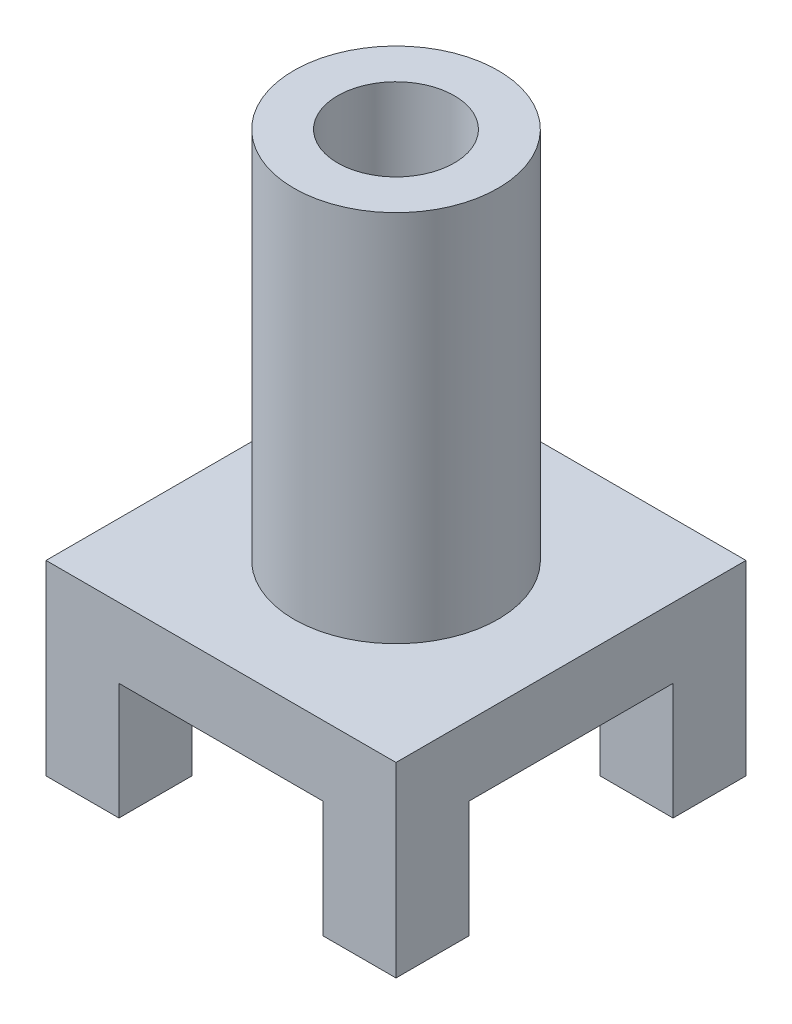
ISO-10303-21;
HEADER;
FILE_DESCRIPTION(('STEP AP214'),'2;1');
FILE_NAME('part.step','',(''),(''),'','','');
FILE_SCHEMA(('AUTOMOTIVE_DESIGN { 1 0 10303 214 1 1 1 1 }'));
ENDSEC;
DATA;
#1=APPLICATION_CONTEXT('core data for automotive mechanical design processes');
#2=APPLICATION_PROTOCOL_DEFINITION('international standard','automotive_design',2000,#1);
#3=PRODUCT_CONTEXT('',#1,'mechanical');
#4=PRODUCT('Part','Part','',(#3));
#5=PRODUCT_RELATED_PRODUCT_CATEGORY('part','',(#4));
#6=PRODUCT_DEFINITION_FORMATION('','',#4);
#7=PRODUCT_DEFINITION_CONTEXT('part definition',#1,'design');
#8=PRODUCT_DEFINITION('design','',#6,#7);
#9=PRODUCT_DEFINITION_SHAPE('','',#8);
#10=(LENGTH_UNIT() NAMED_UNIT(*) SI_UNIT(.MILLI.,.METRE.));
#11=(NAMED_UNIT(*) PLANE_ANGLE_UNIT() SI_UNIT($,.RADIAN.));
#12=(NAMED_UNIT(*) SI_UNIT($,.STERADIAN.) SOLID_ANGLE_UNIT());
#13=UNCERTAINTY_MEASURE_WITH_UNIT(LENGTH_MEASURE(1.E-05),#10,'distance_accuracy_value','');
#14=(GEOMETRIC_REPRESENTATION_CONTEXT(3) GLOBAL_UNCERTAINTY_ASSIGNED_CONTEXT((#13)) GLOBAL_UNIT_ASSIGNED_CONTEXT((#10,
#11,#12)) REPRESENTATION_CONTEXT('',''));
#15=CARTESIAN_POINT('',(0.,0.,0.));
#16=DIRECTION('',(0.,0.,1.));
#17=DIRECTION('',(1.,0.,0.));
#18=AXIS2_PLACEMENT_3D('',#15,#16,#17);
#19=CARTESIAN_POINT('',(0.,0.,0.));
#20=DIRECTION('',(0.,1.,0.));
#21=DIRECTION('',(0.,0.,1.));
#22=AXIS2_PLACEMENT_3D('',#19,#20,#21);
#23=PLANE('',#22);
#24=DIRECTION('',(0.,0.,1.));
#25=VECTOR('',#24,1.);
#26=CARTESIAN_POINT('',(-17.5,0.,-30.));
#27=LINE('',#26,#25);
#28=CARTESIAN_POINT('',(-17.5,0.,17.5));
#29=VERTEX_POINT('',#28);
#30=CARTESIAN_POINT('',(-17.5,0.,30.));
#31=VERTEX_POINT('',#30);
#32=EDGE_CURVE('E64',#29,#31,#27,.T.);
#33=ORIENTED_EDGE('',*,*,#32,.T.);
#34=DIRECTION('',(1.,0.,0.));
#35=VECTOR('',#34,1.);
#36=CARTESIAN_POINT('',(-30.,0.,30.));
#37=LINE('',#36,#35);
#38=CARTESIAN_POINT('',(-30.,0.,30.));
#39=VERTEX_POINT('',#38);
#40=EDGE_CURVE('E280',#39,#31,#37,.T.);
#41=ORIENTED_EDGE('',*,*,#40,.F.);
#42=DIRECTION('',(0.,0.,-1.));
#43=VECTOR('',#42,1.);
#44=CARTESIAN_POINT('',(-30.,0.,30.));
#45=LINE('',#44,#43);
#46=CARTESIAN_POINT('',(-30.,0.,17.5));
#47=VERTEX_POINT('',#46);
#48=EDGE_CURVE('E259',#39,#47,#45,.T.);
#49=ORIENTED_EDGE('',*,*,#48,.T.);
#50=DIRECTION('',(1.,0.,0.));
#51=VECTOR('',#50,1.);
#52=CARTESIAN_POINT('',(-30.,0.,17.5));
#53=LINE('',#52,#51);
#54=EDGE_CURVE('E241',#47,#29,#53,.T.);
#55=ORIENTED_EDGE('',*,*,#54,.T.);
#56=EDGE_LOOP('',(#33,#41,#49,#55));
#57=FACE_BOUND('',#56,.T.);
#58=ADVANCED_FACE('F39',(#57),#23,.F.);
#59=CARTESIAN_POINT('',(-17.5,0.,-30.));
#60=VERTEX_POINT('',#59);
#61=CARTESIAN_POINT('',(-17.5,0.,-17.5));
#62=VERTEX_POINT('',#61);
#63=EDGE_CURVE('E201',#60,#62,#27,.T.);
#64=ORIENTED_EDGE('',*,*,#63,.T.);
#65=DIRECTION('',(1.,0.,0.));
#66=VECTOR('',#65,1.);
#67=CARTESIAN_POINT('',(-30.,0.,-17.5));
#68=LINE('',#67,#66);
#69=CARTESIAN_POINT('',(-30.,0.,-17.5));
#70=VERTEX_POINT('',#69);
#71=EDGE_CURVE('E246',#70,#62,#68,.T.);
#72=ORIENTED_EDGE('',*,*,#71,.F.);
#73=CARTESIAN_POINT('',(-30.,0.,-30.));
#74=VERTEX_POINT('',#73);
#75=EDGE_CURVE('E284',#70,#74,#45,.T.);
#76=ORIENTED_EDGE('',*,*,#75,.T.);
#77=DIRECTION('',(1.,0.,0.));
#78=VECTOR('',#77,1.);
#79=CARTESIAN_POINT('',(-30.,0.,-30.));
#80=LINE('',#79,#78);
#81=EDGE_CURVE('E270',#74,#60,#80,.T.);
#82=ORIENTED_EDGE('',*,*,#81,.T.);
#83=EDGE_LOOP('',(#64,#72,#76,#82));
#84=FACE_BOUND('',#83,.T.);
#85=ADVANCED_FACE('F376',(#84),#23,.F.);
#86=CARTESIAN_POINT('',(-30.,0.,-17.5));
#87=DIRECTION('',(0.,0.,-1.));
#88=DIRECTION('',(-1.,0.,0.));
#89=AXIS2_PLACEMENT_3D('',#86,#87,#88);
#90=PLANE('',#89);
#91=DIRECTION('',(0.,-1.,0.));
#92=VECTOR('',#91,1.);
#93=CARTESIAN_POINT('',(-17.5,0.,-17.5));
#94=LINE('',#93,#92);
#95=CARTESIAN_POINT('',(-17.5,20.,-17.5));
#96=VERTEX_POINT('',#95);
#97=EDGE_CURVE('E174',#96,#62,#94,.T.);
#98=ORIENTED_EDGE('',*,*,#97,.F.);
#99=DIRECTION('',(1.,0.,0.));
#100=VECTOR('',#99,1.);
#101=CARTESIAN_POINT('',(-30.,20.,-17.5));
#102=LINE('',#101,#100);
#103=CARTESIAN_POINT('',(-30.,20.,-17.5));
#104=VERTEX_POINT('',#103);
#105=EDGE_CURVE('E251',#104,#96,#102,.T.);
#106=ORIENTED_EDGE('',*,*,#105,.F.);
#107=DIRECTION('',(0.,1.,0.));
#108=VECTOR('',#107,1.);
#109=CARTESIAN_POINT('',(-30.,0.,-17.5));
#110=LINE('',#109,#108);
#111=EDGE_CURVE('E217',#70,#104,#110,.T.);
#112=ORIENTED_EDGE('',*,*,#111,.F.);
#113=ORIENTED_EDGE('',*,*,#71,.T.);
#114=EDGE_LOOP('',(#98,#106,#112,#113));
#115=FACE_BOUND('',#114,.T.);
#116=ADVANCED_FACE('F341',(#115),#90,.F.);
#117=CARTESIAN_POINT('',(-30.,0.,17.5));
#118=DIRECTION('',(0.,0.,-1.));
#119=DIRECTION('',(-1.,0.,0.));
#120=AXIS2_PLACEMENT_3D('',#117,#118,#119);
#121=PLANE('',#120);
#122=DIRECTION('',(1.,0.,0.));
#123=VECTOR('',#122,1.);
#124=CARTESIAN_POINT('',(-30.,20.,17.5));
#125=LINE('',#124,#123);
#126=CARTESIAN_POINT('',(-30.,20.,17.5));
#127=VERTEX_POINT('',#126);
#128=CARTESIAN_POINT('',(-17.5,20.,17.5));
#129=VERTEX_POINT('',#128);
#130=EDGE_CURVE('E236',#127,#129,#125,.T.);
#131=ORIENTED_EDGE('',*,*,#130,.T.);
#132=DIRECTION('',(0.,-1.,0.));
#133=VECTOR('',#132,1.);
#134=CARTESIAN_POINT('',(-17.5,0.,17.5));
#135=LINE('',#134,#133);
#136=EDGE_CURVE('E292',#129,#29,#135,.T.);
#137=ORIENTED_EDGE('',*,*,#136,.T.);
#138=ORIENTED_EDGE('',*,*,#54,.F.);
#139=DIRECTION('',(0.,1.,0.));
#140=VECTOR('',#139,1.);
#141=CARTESIAN_POINT('',(-30.,0.,17.5));
#142=LINE('',#141,#140);
#143=EDGE_CURVE('E222',#47,#127,#142,.T.);
#144=ORIENTED_EDGE('',*,*,#143,.T.);
#145=EDGE_LOOP('',(#131,#137,#138,#144));
#146=FACE_BOUND('',#145,.T.);
#147=ADVANCED_FACE('F338',(#146),#121,.T.);
#148=CARTESIAN_POINT('',(17.5,0.,30.));
#149=VERTEX_POINT('',#148);
#150=CARTESIAN_POINT('',(30.,0.,30.));
#151=VERTEX_POINT('',#150);
#152=EDGE_CURVE('E279',#149,#151,#37,.T.);
#153=ORIENTED_EDGE('',*,*,#152,.F.);
#154=DIRECTION('',(0.,0.,1.));
#155=VECTOR('',#154,1.);
#156=CARTESIAN_POINT('',(17.5,0.,-30.));
#157=LINE('',#156,#155);
#158=CARTESIAN_POINT('',(17.5,0.,17.5));
#159=VERTEX_POINT('',#158);
#160=EDGE_CURVE('E205',#159,#149,#157,.T.);
#161=ORIENTED_EDGE('',*,*,#160,.F.);
#162=CARTESIAN_POINT('',(30.,0.,17.5));
#163=VERTEX_POINT('',#162);
#164=EDGE_CURVE('E240',#159,#163,#53,.T.);
#165=ORIENTED_EDGE('',*,*,#164,.T.);
#166=DIRECTION('',(0.,0.,-1.));
#167=VECTOR('',#166,1.);
#168=CARTESIAN_POINT('',(30.,0.,30.));
#169=LINE('',#168,#167);
#170=EDGE_CURVE('E275',#151,#163,#169,.T.);
#171=ORIENTED_EDGE('',*,*,#170,.F.);
#172=EDGE_LOOP('',(#153,#161,#165,#171));
#173=FACE_BOUND('',#172,.T.);
#174=ADVANCED_FACE('F313',(#173),#23,.F.);
#175=CARTESIAN_POINT('',(-30.,32.,-30.));
#176=DIRECTION('',(0.,0.,-1.));
#177=DIRECTION('',(-1.,0.,0.));
#178=AXIS2_PLACEMENT_3D('',#175,#176,#177);
#179=PLANE('',#178);
#180=DIRECTION('',(0.,1.,0.));
#181=VECTOR('',#180,1.);
#182=CARTESIAN_POINT('',(17.5,0.,-30.));
#183=LINE('',#182,#181);
#184=CARTESIAN_POINT('',(17.5,0.,-30.));
#185=VERTEX_POINT('',#184);
#186=CARTESIAN_POINT('',(17.5,20.,-30.));
#187=VERTEX_POINT('',#186);
#188=EDGE_CURVE('E165',#185,#187,#183,.T.);
#189=ORIENTED_EDGE('',*,*,#188,.T.);
#190=DIRECTION('',(1.,0.,0.));
#191=VECTOR('',#190,1.);
#192=CARTESIAN_POINT('',(-17.5,20.,-30.));
#193=LINE('',#192,#191);
#194=CARTESIAN_POINT('',(-17.5,20.,-30.));
#195=VERTEX_POINT('',#194);
#196=EDGE_CURVE('E154',#195,#187,#193,.T.);
#197=ORIENTED_EDGE('',*,*,#196,.F.);
#198=DIRECTION('',(0.,1.,0.));
#199=VECTOR('',#198,1.);
#200=CARTESIAN_POINT('',(-17.5,0.,-30.));
#201=LINE('',#200,#199);
#202=EDGE_CURVE('E181',#60,#195,#201,.T.);
#203=ORIENTED_EDGE('',*,*,#202,.F.);
#204=ORIENTED_EDGE('',*,*,#81,.F.);
#205=DIRECTION('',(0.,-1.,0.));
#206=VECTOR('',#205,1.);
#207=CARTESIAN_POINT('',(-30.,32.,-30.));
#208=LINE('',#207,#206);
#209=CARTESIAN_POINT('',(-30.,32.,-30.));
#210=VERTEX_POINT('',#209);
#211=EDGE_CURVE('E288',#210,#74,#208,.T.);
#212=ORIENTED_EDGE('',*,*,#211,.F.);
#213=DIRECTION('',(1.,0.,0.));
#214=VECTOR('',#213,1.);
#215=CARTESIAN_POINT('',(-30.,32.,-30.));
#216=LINE('',#215,#214);
#217=CARTESIAN_POINT('',(30.,32.,-30.));
#218=VERTEX_POINT('',#217);
#219=EDGE_CURVE('E254',#210,#218,#216,.T.);
#220=ORIENTED_EDGE('',*,*,#219,.T.);
#221=DIRECTION('',(0.,-1.,0.));
#222=VECTOR('',#221,1.);
#223=CARTESIAN_POINT('',(30.,32.,-30.));
#224=LINE('',#223,#222);
#225=CARTESIAN_POINT('',(30.,0.,-30.));
#226=VERTEX_POINT('',#225);
#227=EDGE_CURVE('E269',#218,#226,#224,.T.);
#228=ORIENTED_EDGE('',*,*,#227,.T.);
#229=EDGE_CURVE('E179',#185,#226,#80,.T.);
#230=ORIENTED_EDGE('',*,*,#229,.F.);
#231=EDGE_LOOP('',(#189,#197,#203,#204,#212,#220,#228,#230));
#232=FACE_BOUND('',#231,.T.);
#233=ADVANCED_FACE('F41',(#232),#179,.T.);
#234=CARTESIAN_POINT('',(-30.,32.,30.));
#235=DIRECTION('',(-1.,0.,0.));
#236=DIRECTION('',(0.,0.,1.));
#237=AXIS2_PLACEMENT_3D('',#234,#235,#236);
#238=PLANE('',#237);
#239=ORIENTED_EDGE('',*,*,#111,.T.);
#240=DIRECTION('',(0.,0.,-1.));
#241=VECTOR('',#240,1.);
#242=CARTESIAN_POINT('',(-30.,20.,17.5));
#243=LINE('',#242,#241);
#244=EDGE_CURVE('E214',#127,#104,#243,.T.);
#245=ORIENTED_EDGE('',*,*,#244,.F.);
#246=ORIENTED_EDGE('',*,*,#143,.F.);
#247=ORIENTED_EDGE('',*,*,#48,.F.);
#248=DIRECTION('',(0.,-1.,0.));
#249=VECTOR('',#248,1.);
#250=CARTESIAN_POINT('',(-30.,32.,30.));
#251=LINE('',#250,#249);
#252=CARTESIAN_POINT('',(-30.,32.,30.));
#253=VERTEX_POINT('',#252);
#254=EDGE_CURVE('E293',#253,#39,#251,.T.);
#255=ORIENTED_EDGE('',*,*,#254,.F.);
#256=DIRECTION('',(0.,0.,-1.));
#257=VECTOR('',#256,1.);
#258=CARTESIAN_POINT('',(-30.,32.,30.));
#259=LINE('',#258,#257);
#260=EDGE_CURVE('E265',#253,#210,#259,.T.);
#261=ORIENTED_EDGE('',*,*,#260,.T.);
#262=ORIENTED_EDGE('',*,*,#211,.T.);
#263=ORIENTED_EDGE('',*,*,#75,.F.);
#264=EDGE_LOOP('',(#239,#245,#246,#247,#255,#261,#262,#263));
#265=FACE_BOUND('',#264,.T.);
#266=ADVANCED_FACE('F336',(#265),#238,.T.);
#267=CARTESIAN_POINT('',(-30.,32.,30.));
#268=DIRECTION('',(0.,0.,-1.));
#269=DIRECTION('',(-1.,0.,0.));
#270=AXIS2_PLACEMENT_3D('',#267,#268,#269);
#271=PLANE('',#270);
#272=DIRECTION('',(1.,0.,0.));
#273=VECTOR('',#272,1.);
#274=CARTESIAN_POINT('',(-17.5,20.,30.));
#275=LINE('',#274,#273);
#276=CARTESIAN_POINT('',(-17.5,20.,30.));
#277=VERTEX_POINT('',#276);
#278=CARTESIAN_POINT('',(17.5,20.,30.));
#279=VERTEX_POINT('',#278);
#280=EDGE_CURVE('E187',#277,#279,#275,.T.);
#281=ORIENTED_EDGE('',*,*,#280,.T.);
#282=DIRECTION('',(0.,1.,0.));
#283=VECTOR('',#282,1.);
#284=CARTESIAN_POINT('',(17.5,0.,30.));
#285=LINE('',#284,#283);
#286=EDGE_CURVE('E191',#149,#279,#285,.T.);
#287=ORIENTED_EDGE('',*,*,#286,.F.);
#288=ORIENTED_EDGE('',*,*,#152,.T.);
#289=DIRECTION('',(0.,-1.,0.));
#290=VECTOR('',#289,1.);
#291=CARTESIAN_POINT('',(30.,32.,30.));
#292=LINE('',#291,#290);
#293=CARTESIAN_POINT('',(30.,32.,30.));
#294=VERTEX_POINT('',#293);
#295=EDGE_CURVE('E296',#294,#151,#292,.T.);
#296=ORIENTED_EDGE('',*,*,#295,.F.);
#297=DIRECTION('',(1.,0.,0.));
#298=VECTOR('',#297,1.);
#299=CARTESIAN_POINT('',(-30.,32.,30.));
#300=LINE('',#299,#298);
#301=EDGE_CURVE('E262',#253,#294,#300,.T.);
#302=ORIENTED_EDGE('',*,*,#301,.F.);
#303=ORIENTED_EDGE('',*,*,#254,.T.);
#304=ORIENTED_EDGE('',*,*,#40,.T.);
#305=DIRECTION('',(0.,1.,0.));
#306=VECTOR('',#305,1.);
#307=CARTESIAN_POINT('',(-17.5,0.,30.));
#308=LINE('',#307,#306);
#309=EDGE_CURVE('E166',#31,#277,#308,.T.);
#310=ORIENTED_EDGE('',*,*,#309,.T.);
#311=EDGE_LOOP('',(#281,#287,#288,#296,#302,#303,#304,#310));
#312=FACE_BOUND('',#311,.T.);
#313=ADVANCED_FACE('F329',(#312),#271,.F.);
#314=CARTESIAN_POINT('',(30.,32.,30.));
#315=DIRECTION('',(-1.,0.,0.));
#316=DIRECTION('',(0.,0.,1.));
#317=AXIS2_PLACEMENT_3D('',#314,#315,#316);
#318=PLANE('',#317);
#319=DIRECTION('',(0.,0.,-1.));
#320=VECTOR('',#319,1.);
#321=CARTESIAN_POINT('',(30.,20.,17.5));
#322=LINE('',#321,#320);
#323=CARTESIAN_POINT('',(30.,20.,17.5));
#324=VERTEX_POINT('',#323);
#325=CARTESIAN_POINT('',(30.,20.,-17.5));
#326=VERTEX_POINT('',#325);
#327=EDGE_CURVE('E213',#324,#326,#322,.T.);
#328=ORIENTED_EDGE('',*,*,#327,.T.);
#329=DIRECTION('',(0.,1.,0.));
#330=VECTOR('',#329,1.);
#331=CARTESIAN_POINT('',(30.,0.,-17.5));
#332=LINE('',#331,#330);
#333=CARTESIAN_POINT('',(30.,0.,-17.5));
#334=VERTEX_POINT('',#333);
#335=EDGE_CURVE('E229',#334,#326,#332,.T.);
#336=ORIENTED_EDGE('',*,*,#335,.F.);
#337=EDGE_CURVE('E274',#334,#226,#169,.T.);
#338=ORIENTED_EDGE('',*,*,#337,.T.);
#339=ORIENTED_EDGE('',*,*,#227,.F.);
#340=DIRECTION('',(0.,0.,-1.));
#341=VECTOR('',#340,1.);
#342=CARTESIAN_POINT('',(30.,32.,30.));
#343=LINE('',#342,#341);
#344=EDGE_CURVE('E258',#294,#218,#343,.T.);
#345=ORIENTED_EDGE('',*,*,#344,.F.);
#346=ORIENTED_EDGE('',*,*,#295,.T.);
#347=ORIENTED_EDGE('',*,*,#170,.T.);
#348=DIRECTION('',(0.,1.,0.));
#349=VECTOR('',#348,1.);
#350=CARTESIAN_POINT('',(30.,0.,17.5));
#351=LINE('',#350,#349);
#352=EDGE_CURVE('E218',#163,#324,#351,.T.);
#353=ORIENTED_EDGE('',*,*,#352,.T.);
#354=EDGE_LOOP('',(#328,#336,#338,#339,#345,#346,#347,#353));
#355=FACE_BOUND('',#354,.T.);
#356=ADVANCED_FACE('F359',(#355),#318,.F.);
#357=CARTESIAN_POINT('',(0.,32.,0.));
#358=DIRECTION('',(0.,1.,0.));
#359=DIRECTION('',(0.,0.,1.));
#360=AXIS2_PLACEMENT_3D('',#357,#358,#359);
#361=PLANE('',#360);
#362=CARTESIAN_POINT('',(0.,32.,0.));
#363=DIRECTION('',(0.,1.,0.));
#364=DIRECTION('',(0.,0.,1.));
#365=AXIS2_PLACEMENT_3D('',#362,#363,#364);
#366=CIRCLE('',#365,17.5);
#367=CARTESIAN_POINT('',(0.,32.,17.5));
#368=VERTEX_POINT('',#367);
#369=EDGE_CURVE('E11',#368,#368,#366,.T.);
#370=ORIENTED_EDGE('',*,*,#369,.F.);
#371=EDGE_LOOP('',(#370));
#372=FACE_BOUND('',#371,.T.);
#373=ORIENTED_EDGE('',*,*,#219,.F.);
#374=ORIENTED_EDGE('',*,*,#260,.F.);
#375=ORIENTED_EDGE('',*,*,#301,.T.);
#376=ORIENTED_EDGE('',*,*,#344,.T.);
#377=EDGE_LOOP('',(#373,#374,#375,#376));
#378=FACE_BOUND('',#377,.T.);
#379=ADVANCED_FACE('F364',(#372,#378),#361,.T.);
#380=CARTESIAN_POINT('',(17.5,0.,-17.5));
#381=VERTEX_POINT('',#380);
#382=EDGE_CURVE('E245',#381,#334,#68,.T.);
#383=ORIENTED_EDGE('',*,*,#382,.F.);
#384=EDGE_CURVE('E206',#185,#381,#157,.T.);
#385=ORIENTED_EDGE('',*,*,#384,.F.);
#386=ORIENTED_EDGE('',*,*,#229,.T.);
#387=ORIENTED_EDGE('',*,*,#337,.F.);
#388=EDGE_LOOP('',(#383,#385,#386,#387));
#389=FACE_BOUND('',#388,.T.);
#390=ADVANCED_FACE('F362',(#389),#23,.F.);
#391=CARTESIAN_POINT('',(-30.,20.,17.5));
#392=DIRECTION('',(0.,-1.,0.));
#393=DIRECTION('',(0.,0.,-1.));
#394=AXIS2_PLACEMENT_3D('',#391,#392,#393);
#395=PLANE('',#394);
#396=CARTESIAN_POINT('',(0.,20.,0.));
#397=DIRECTION('',(0.,-1.,0.));
#398=DIRECTION('',(0.,0.,-1.));
#399=AXIS2_PLACEMENT_3D('',#396,#397,#398);
#400=CIRCLE('',#399,10.);
#401=CARTESIAN_POINT('',(0.,20.,-10.));
#402=VERTEX_POINT('',#401);
#403=EDGE_CURVE('E452',#402,#402,#400,.T.);
#404=ORIENTED_EDGE('',*,*,#403,.F.);
#405=EDGE_LOOP('',(#404));
#406=FACE_BOUND('',#405,.T.);
#407=CARTESIAN_POINT('',(17.5,20.,17.5));
#408=VERTEX_POINT('',#407);
#409=EDGE_CURVE('E225',#408,#324,#125,.T.);
#410=ORIENTED_EDGE('',*,*,#409,.F.);
#411=DIRECTION('',(0.,0.,1.));
#412=VECTOR('',#411,1.);
#413=CARTESIAN_POINT('',(17.5,20.,-30.));
#414=LINE('',#413,#412);
#415=EDGE_CURVE('E175',#408,#279,#414,.T.);
#416=ORIENTED_EDGE('',*,*,#415,.T.);
#417=ORIENTED_EDGE('',*,*,#280,.F.);
#418=DIRECTION('',(0.,0.,1.));
#419=VECTOR('',#418,1.);
#420=CARTESIAN_POINT('',(-17.5,20.,-30.));
#421=LINE('',#420,#419);
#422=EDGE_CURVE('E184',#129,#277,#421,.T.);
#423=ORIENTED_EDGE('',*,*,#422,.F.);
#424=ORIENTED_EDGE('',*,*,#130,.F.);
#425=ORIENTED_EDGE('',*,*,#244,.T.);
#426=ORIENTED_EDGE('',*,*,#105,.T.);
#427=EDGE_CURVE('E56',#195,#96,#421,.T.);
#428=ORIENTED_EDGE('',*,*,#427,.F.);
#429=ORIENTED_EDGE('',*,*,#196,.T.);
#430=CARTESIAN_POINT('',(17.5,20.,-17.5));
#431=VERTEX_POINT('',#430);
#432=EDGE_CURVE('E158',#187,#431,#414,.T.);
#433=ORIENTED_EDGE('',*,*,#432,.T.);
#434=EDGE_CURVE('E250',#431,#326,#102,.T.);
#435=ORIENTED_EDGE('',*,*,#434,.T.);
#436=ORIENTED_EDGE('',*,*,#327,.F.);
#437=EDGE_LOOP('',(#410,#416,#417,#423,#424,#425,#426,#428,#429,#433,#435,#436));
#438=FACE_BOUND('',#437,.T.);
#439=ADVANCED_FACE('F157',(#406,#438),#395,.T.);
#440=ORIENTED_EDGE('',*,*,#434,.F.);
#441=DIRECTION('',(0.,-1.,0.));
#442=VECTOR('',#441,1.);
#443=CARTESIAN_POINT('',(17.5,0.,-17.5));
#444=LINE('',#443,#442);
#445=EDGE_CURVE('E172',#431,#381,#444,.T.);
#446=ORIENTED_EDGE('',*,*,#445,.T.);
#447=ORIENTED_EDGE('',*,*,#382,.T.);
#448=ORIENTED_EDGE('',*,*,#335,.T.);
#449=EDGE_LOOP('',(#440,#446,#447,#448));
#450=FACE_BOUND('',#449,.T.);
#451=ADVANCED_FACE('F355',(#450),#90,.F.);
#452=DIRECTION('',(0.,-1.,0.));
#453=VECTOR('',#452,1.);
#454=CARTESIAN_POINT('',(17.5,0.,17.5));
#455=LINE('',#454,#453);
#456=EDGE_CURVE('E43',#408,#159,#455,.T.);
#457=ORIENTED_EDGE('',*,*,#456,.F.);
#458=ORIENTED_EDGE('',*,*,#409,.T.);
#459=ORIENTED_EDGE('',*,*,#352,.F.);
#460=ORIENTED_EDGE('',*,*,#164,.F.);
#461=EDGE_LOOP('',(#457,#458,#459,#460));
#462=FACE_BOUND('',#461,.T.);
#463=ADVANCED_FACE('F317',(#462),#121,.T.);
#464=CARTESIAN_POINT('',(-17.5,0.,-30.));
#465=DIRECTION('',(1.,0.,0.));
#466=DIRECTION('',(0.,0.,-1.));
#467=AXIS2_PLACEMENT_3D('',#464,#465,#466);
#468=PLANE('',#467);
#469=ORIENTED_EDGE('',*,*,#422,.T.);
#470=ORIENTED_EDGE('',*,*,#309,.F.);
#471=ORIENTED_EDGE('',*,*,#32,.F.);
#472=ORIENTED_EDGE('',*,*,#136,.F.);
#473=EDGE_LOOP('',(#469,#470,#471,#472));
#474=FACE_BOUND('',#473,.T.);
#475=ADVANCED_FACE('F326',(#474),#468,.T.);
#476=CARTESIAN_POINT('',(17.5,0.,-30.));
#477=DIRECTION('',(1.,0.,0.));
#478=DIRECTION('',(0.,0.,-1.));
#479=AXIS2_PLACEMENT_3D('',#476,#477,#478);
#480=PLANE('',#479);
#481=ORIENTED_EDGE('',*,*,#456,.T.);
#482=ORIENTED_EDGE('',*,*,#160,.T.);
#483=ORIENTED_EDGE('',*,*,#286,.T.);
#484=ORIENTED_EDGE('',*,*,#415,.F.);
#485=EDGE_LOOP('',(#481,#482,#483,#484));
#486=FACE_BOUND('',#485,.T.);
#487=ADVANCED_FACE('F307',(#486),#480,.F.);
#488=ORIENTED_EDGE('',*,*,#432,.F.);
#489=ORIENTED_EDGE('',*,*,#188,.F.);
#490=ORIENTED_EDGE('',*,*,#384,.T.);
#491=ORIENTED_EDGE('',*,*,#445,.F.);
#492=EDGE_LOOP('',(#488,#489,#490,#491));
#493=FACE_BOUND('',#492,.T.);
#494=ADVANCED_FACE('F169',(#493),#480,.F.);
#495=ORIENTED_EDGE('',*,*,#97,.T.);
#496=ORIENTED_EDGE('',*,*,#63,.F.);
#497=ORIENTED_EDGE('',*,*,#202,.T.);
#498=ORIENTED_EDGE('',*,*,#427,.T.);
#499=EDGE_LOOP('',(#495,#496,#497,#498));
#500=FACE_BOUND('',#499,.T.);
#501=ADVANCED_FACE('F388',(#500),#468,.T.);
#502=CARTESIAN_POINT('',(0.,96.,0.));
#503=DIRECTION('',(0.,-1.,0.));
#504=DIRECTION('',(0.,0.,-1.));
#505=AXIS2_PLACEMENT_3D('',#502,#503,#504);
#506=CYLINDRICAL_SURFACE('',#505,17.5);
#507=CARTESIAN_POINT('',(0.,96.,0.));
#508=DIRECTION('',(0.,1.,0.));
#509=DIRECTION('',(0.,0.,1.));
#510=AXIS2_PLACEMENT_3D('',#507,#508,#509);
#511=CIRCLE('',#510,17.5);
#512=CARTESIAN_POINT('',(0.,96.,17.5));
#513=VERTEX_POINT('',#512);
#514=EDGE_CURVE('E192',#513,#513,#511,.T.);
#515=ORIENTED_EDGE('',*,*,#514,.F.);
#516=EDGE_LOOP('',(#515));
#517=FACE_BOUND('',#516,.T.);
#518=ORIENTED_EDGE('',*,*,#369,.T.);
#519=EDGE_LOOP('',(#518));
#520=FACE_BOUND('',#519,.T.);
#521=ADVANCED_FACE('F395',(#517,#520),#506,.T.);
#522=CARTESIAN_POINT('',(0.,96.,0.));
#523=DIRECTION('',(0.,1.,0.));
#524=DIRECTION('',(0.,0.,1.));
#525=AXIS2_PLACEMENT_3D('',#522,#523,#524);
#526=PLANE('',#525);
#527=CARTESIAN_POINT('',(0.,96.,0.));
#528=DIRECTION('',(0.,1.,0.));
#529=DIRECTION('',(0.,0.,1.));
#530=AXIS2_PLACEMENT_3D('',#527,#528,#529);
#531=CIRCLE('',#530,10.);
#532=CARTESIAN_POINT('',(0.,96.,10.));
#533=VERTEX_POINT('',#532);
#534=EDGE_CURVE('E455',#533,#533,#531,.T.);
#535=ORIENTED_EDGE('',*,*,#534,.F.);
#536=EDGE_LOOP('',(#535));
#537=FACE_BOUND('',#536,.T.);
#538=ORIENTED_EDGE('',*,*,#514,.T.);
#539=EDGE_LOOP('',(#538));
#540=FACE_BOUND('',#539,.T.);
#541=ADVANCED_FACE('F401',(#537,#540),#526,.T.);
#542=CARTESIAN_POINT('',(0.,0.,0.));
#543=DIRECTION('',(0.,1.,0.));
#544=DIRECTION('',(0.,0.,1.));
#545=AXIS2_PLACEMENT_3D('',#542,#543,#544);
#546=CYLINDRICAL_SURFACE('',#545,10.);
#547=ORIENTED_EDGE('',*,*,#403,.T.);
#548=EDGE_LOOP('',(#547));
#549=FACE_BOUND('',#548,.T.);
#550=ORIENTED_EDGE('',*,*,#534,.T.);
#551=EDGE_LOOP('',(#550));
#552=FACE_BOUND('',#551,.T.);
#553=ADVANCED_FACE('F435',(#549,#552),#546,.F.);
#554=CLOSED_SHELL('',(#58,#85,#116,#147,#174,#233,#266,#313,#356,#379,#390,#439,#451,#463,#475,
#487,#494,#501,#521,#541,#553));
#555=MANIFOLD_SOLID_BREP('B2',#554);
#556=ADVANCED_BREP_SHAPE_REPRESENTATION('',(#18,#555),#14);
#557=SHAPE_DEFINITION_REPRESENTATION(#9,#556);
ENDSEC;
END-ISO-10303-21;
